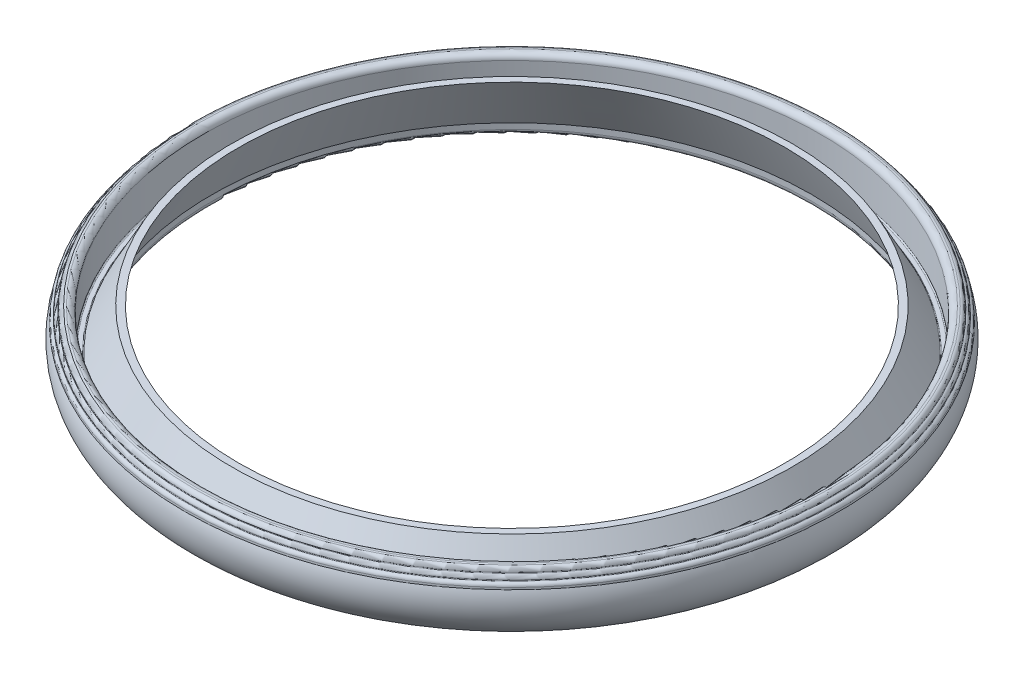
ISO-10303-21;
HEADER;
FILE_DESCRIPTION(('STEP AP214'),'2;1');
FILE_NAME('part.step','',(''),(''),'','','');
FILE_SCHEMA(('AUTOMOTIVE_DESIGN { 1 0 10303 214 1 1 1 1 }'));
ENDSEC;
DATA;
#1=APPLICATION_CONTEXT('core data for automotive mechanical design processes');
#2=APPLICATION_PROTOCOL_DEFINITION('international standard','automotive_design',2000,#1);
#3=PRODUCT_CONTEXT('',#1,'mechanical');
#4=PRODUCT('Part','Part','',(#3));
#5=PRODUCT_RELATED_PRODUCT_CATEGORY('part','',(#4));
#6=PRODUCT_DEFINITION_FORMATION('','',#4);
#7=PRODUCT_DEFINITION_CONTEXT('part definition',#1,'design');
#8=PRODUCT_DEFINITION('design','',#6,#7);
#9=PRODUCT_DEFINITION_SHAPE('','',#8);
#10=(LENGTH_UNIT() NAMED_UNIT(*) SI_UNIT(.MILLI.,.METRE.));
#11=(NAMED_UNIT(*) PLANE_ANGLE_UNIT() SI_UNIT($,.RADIAN.));
#12=(NAMED_UNIT(*) SI_UNIT($,.STERADIAN.) SOLID_ANGLE_UNIT());
#13=UNCERTAINTY_MEASURE_WITH_UNIT(LENGTH_MEASURE(1.E-05),#10,'distance_accuracy_value','');
#14=(GEOMETRIC_REPRESENTATION_CONTEXT(3) GLOBAL_UNCERTAINTY_ASSIGNED_CONTEXT((#13)) GLOBAL_UNIT_ASSIGNED_CONTEXT((#10,
#11,#12)) REPRESENTATION_CONTEXT('',''));
#15=CARTESIAN_POINT('',(0.,0.,0.));
#16=DIRECTION('',(0.,0.,1.));
#17=DIRECTION('',(1.,0.,0.));
#18=AXIS2_PLACEMENT_3D('',#15,#16,#17);
#19=CARTESIAN_POINT('',(0.,2.53999999999997,0.));
#20=DIRECTION('',(0.,-1.,0.));
#21=DIRECTION('',(0.,0.,-1.));
#22=AXIS2_PLACEMENT_3D('',#19,#20,#21);
#23=TOROIDAL_SURFACE('',#22,134.62,2.53999999999996);
#24=CARTESIAN_POINT('',(0.,0.,0.));
#25=DIRECTION('',(0.,-1.,0.));
#26=DIRECTION('',(0.,0.,-1.));
#27=AXIS2_PLACEMENT_3D('',#24,#25,#26);
#28=CIRCLE('',#27,134.62);
#29=CARTESIAN_POINT('',(0.,0.,-134.62));
#30=VERTEX_POINT('',#29);
#31=EDGE_CURVE('E101',#30,#30,#28,.T.);
#32=ORIENTED_EDGE('',*,*,#31,.T.);
#33=EDGE_LOOP('',(#32));
#34=FACE_BOUND('',#33,.T.);
#35=CARTESIAN_POINT('',(0.,2.53999999999998,0.));
#36=DIRECTION('',(0.,-1.,0.));
#37=DIRECTION('',(0.,0.,-1.));
#38=AXIS2_PLACEMENT_3D('',#35,#36,#37);
#39=CIRCLE('',#38,132.08);
#40=CARTESIAN_POINT('',(0.,2.53999999999998,-132.08));
#41=VERTEX_POINT('',#40);
#42=EDGE_CURVE('E89',#41,#41,#39,.T.);
#43=ORIENTED_EDGE('',*,*,#42,.F.);
#44=EDGE_LOOP('',(#43));
#45=FACE_BOUND('',#44,.T.);
#46=ADVANCED_FACE('F36',(#34,#45),#23,.T.);
#47=CARTESIAN_POINT('',(0.,0.,0.));
#48=DIRECTION('',(0.,-1.,0.));
#49=DIRECTION('',(0.,0.,-1.));
#50=AXIS2_PLACEMENT_3D('',#47,#48,#49);
#51=CYLINDRICAL_SURFACE('',#50,132.08);
#52=CARTESIAN_POINT('',(0.,5.07999999999995,0.));
#53=DIRECTION('',(0.,-1.,0.));
#54=DIRECTION('',(0.,0.,-1.));
#55=AXIS2_PLACEMENT_3D('',#52,#53,#54);
#56=CIRCLE('',#55,132.08);
#57=CARTESIAN_POINT('',(0.,5.07999999999995,-132.08));
#58=VERTEX_POINT('',#57);
#59=EDGE_CURVE('E93',#58,#58,#56,.T.);
#60=ORIENTED_EDGE('',*,*,#59,.F.);
#61=EDGE_LOOP('',(#60));
#62=FACE_BOUND('',#61,.T.);
#63=ORIENTED_EDGE('',*,*,#42,.T.);
#64=EDGE_LOOP('',(#63));
#65=FACE_BOUND('',#64,.T.);
#66=ADVANCED_FACE('F129',(#62,#65),#51,.F.);
#67=CARTESIAN_POINT('',(0.,5.07999999999995,0.));
#68=DIRECTION('',(0.,-1.,0.));
#69=DIRECTION('',(0.,0.,-1.));
#70=AXIS2_PLACEMENT_3D('',#67,#68,#69);
#71=CONICAL_SURFACE('',#70,132.08,0.455530934770517);
#72=CARTESIAN_POINT('',(0.,28.829,0.));
#73=DIRECTION('',(0.,-1.,0.));
#74=DIRECTION('',(0.,0.,-1.));
#75=AXIS2_PLACEMENT_3D('',#72,#73,#74);
#76=CIRCLE('',#75,120.445484950661);
#77=CARTESIAN_POINT('',(0.,28.829,-120.445484950661));
#78=VERTEX_POINT('',#77);
#79=EDGE_CURVE('E95',#78,#78,#76,.T.);
#80=ORIENTED_EDGE('',*,*,#79,.F.);
#81=EDGE_LOOP('',(#80));
#82=FACE_BOUND('',#81,.T.);
#83=ORIENTED_EDGE('',*,*,#59,.T.);
#84=EDGE_LOOP('',(#83));
#85=FACE_BOUND('',#84,.T.);
#86=ADVANCED_FACE('F133',(#82,#85),#71,.F.);
#87=CARTESIAN_POINT('',(1.31951923373762E-13,28.829,0.));
#88=DIRECTION('',(0.,-1.,0.));
#89=DIRECTION('',(0.,0.,-1.));
#90=AXIS2_PLACEMENT_3D('',#87,#88,#89);
#91=PLANE('',#90);
#92=CARTESIAN_POINT('',(0.,28.829,0.));
#93=DIRECTION('',(0.,-1.,0.));
#94=DIRECTION('',(0.,0.,-1.));
#95=AXIS2_PLACEMENT_3D('',#92,#93,#94);
#96=CIRCLE('',#95,123.477519152832);
#97=CARTESIAN_POINT('',(0.,28.829,-123.477519152832));
#98=VERTEX_POINT('',#97);
#99=EDGE_CURVE('E97',#98,#98,#96,.T.);
#100=ORIENTED_EDGE('',*,*,#99,.F.);
#101=EDGE_LOOP('',(#100));
#102=FACE_BOUND('',#101,.T.);
#103=ORIENTED_EDGE('',*,*,#79,.T.);
#104=EDGE_LOOP('',(#103));
#105=FACE_BOUND('',#104,.T.);
#106=ADVANCED_FACE('F284',(#102,#105),#91,.F.);
#107=CARTESIAN_POINT('',(0.,28.829,0.));
#108=DIRECTION('',(0.,-1.,0.));
#109=DIRECTION('',(0.,0.,-1.));
#110=AXIS2_PLACEMENT_3D('',#107,#108,#109);
#111=CONICAL_SURFACE('',#110,123.477519152832,0.497418836818253);
#112=CARTESIAN_POINT('',(0.,10.5272033497882,0.));
#113=DIRECTION('',(0.,1.,0.));
#114=DIRECTION('',(0.,0.,1.));
#115=AXIS2_PLACEMENT_3D('',#112,#113,#114);
#116=CIRCLE('',#115,133.414583957685);
#117=CARTESIAN_POINT('',(0.,10.5272033497882,133.414583957685));
#118=VERTEX_POINT('',#117);
#119=EDGE_CURVE('E79',#118,#118,#116,.T.);
#120=ORIENTED_EDGE('',*,*,#119,.T.);
#121=EDGE_LOOP('',(#120));
#122=FACE_BOUND('',#121,.T.);
#123=ORIENTED_EDGE('',*,*,#99,.T.);
#124=EDGE_LOOP('',(#123));
#125=FACE_BOUND('',#124,.T.);
#126=ADVANCED_FACE('F274',(#122,#125),#111,.T.);
#127=CARTESIAN_POINT('',(0.,10.2616,0.));
#128=DIRECTION('',(0.,1.,0.));
#129=DIRECTION('',(0.,0.,1.));
#130=AXIS2_PLACEMENT_3D('',#127,#128,#129);
#131=PLANE('',#130);
#132=CARTESIAN_POINT('',(0.,10.2616,0.));
#133=DIRECTION('',(0.,1.,0.));
#134=DIRECTION('',(0.,0.,1.));
#135=AXIS2_PLACEMENT_3D('',#132,#133,#134);
#136=CIRCLE('',#135,133.861023050917);
#137=CARTESIAN_POINT('',(0.,10.2616,133.861023050917));
#138=VERTEX_POINT('',#137);
#139=EDGE_CURVE('E85',#138,#138,#136,.F.);
#140=ORIENTED_EDGE('',*,*,#139,.T.);
#141=EDGE_LOOP('',(#140));
#142=FACE_BOUND('',#141,.T.);
#143=CARTESIAN_POINT('',(0.,10.2616,0.));
#144=DIRECTION('',(0.,1.,0.));
#145=DIRECTION('',(0.,0.,1.));
#146=AXIS2_PLACEMENT_3D('',#143,#144,#145);
#147=CIRCLE('',#146,135.587896276782);
#148=CARTESIAN_POINT('',(0.,10.2616,135.587896276782));
#149=VERTEX_POINT('',#148);
#150=EDGE_CURVE('E84',#149,#149,#147,.T.);
#151=ORIENTED_EDGE('',*,*,#150,.T.);
#152=EDGE_LOOP('',(#151));
#153=FACE_BOUND('',#152,.T.);
#154=ADVANCED_FACE('F263',(#142,#153),#131,.T.);
#155=CARTESIAN_POINT('',(0.,0.,0.));
#156=DIRECTION('',(0.,-1.,0.));
#157=DIRECTION('',(0.,0.,-1.));
#158=AXIS2_PLACEMENT_3D('',#155,#156,#157);
#159=CYLINDRICAL_SURFACE('',#158,136.095896276782);
#160=CARTESIAN_POINT('',(0.,26.0242975407193,0.));
#161=DIRECTION('',(0.,1.,0.));
#162=DIRECTION('',(0.,0.,1.));
#163=AXIS2_PLACEMENT_3D('',#160,#161,#162);
#164=CIRCLE('',#163,136.095896276782);
#165=CARTESIAN_POINT('',(0.,26.0242975407193,136.095896276782));
#166=VERTEX_POINT('',#165);
#167=EDGE_CURVE('E68',#166,#166,#164,.T.);
#168=ORIENTED_EDGE('',*,*,#167,.T.);
#169=EDGE_LOOP('',(#168));
#170=FACE_BOUND('',#169,.T.);
#171=CARTESIAN_POINT('',(0.,10.7696,0.));
#172=DIRECTION('',(0.,1.,0.));
#173=DIRECTION('',(0.,0.,1.));
#174=AXIS2_PLACEMENT_3D('',#171,#172,#173);
#175=CIRCLE('',#174,136.095896276782);
#176=CARTESIAN_POINT('',(0.,10.7696,136.095896276782));
#177=VERTEX_POINT('',#176);
#178=EDGE_CURVE('E77',#177,#177,#175,.F.);
#179=ORIENTED_EDGE('',*,*,#178,.T.);
#180=EDGE_LOOP('',(#179));
#181=FACE_BOUND('',#180,.T.);
#182=ADVANCED_FACE('F256',(#170,#181),#159,.F.);
#183=CARTESIAN_POINT('',(0.,28.7962211334353,0.));
#184=DIRECTION('',(0.,-1.,0.));
#185=DIRECTION('',(0.,0.,-1.));
#186=AXIS2_PLACEMENT_3D('',#183,#184,#185);
#187=CONICAL_SURFACE('',#186,136.095896276782,1.48352986419517);
#188=CARTESIAN_POINT('',(0.,28.4793221398566,0.));
#189=DIRECTION('',(0.,1.,0.));
#190=DIRECTION('',(0.,0.,1.));
#191=AXIS2_PLACEMENT_3D('',#188,#189,#190);
#192=CIRCLE('',#191,139.718068348079);
#193=CARTESIAN_POINT('',(0.,28.4793221398566,139.718068348079));
#194=VERTEX_POINT('',#193);
#195=EDGE_CURVE('E59',#194,#194,#192,.T.);
#196=ORIENTED_EDGE('',*,*,#195,.T.);
#197=EDGE_LOOP('',(#196));
#198=FACE_BOUND('',#197,.T.);
#199=CARTESIAN_POINT('',(0.,28.5546320738723,0.));
#200=DIRECTION('',(0.,-1.,0.));
#201=DIRECTION('',(0.,0.,-1.));
#202=AXIS2_PLACEMENT_3D('',#199,#200,#201);
#203=CIRCLE('',#202,138.857271863361);
#204=CARTESIAN_POINT('',(0.,28.5546320738723,-138.857271863361));
#205=VERTEX_POINT('',#204);
#206=EDGE_CURVE('E74',#205,#205,#203,.T.);
#207=ORIENTED_EDGE('',*,*,#206,.T.);
#208=EDGE_LOOP('',(#207));
#209=FACE_BOUND('',#208,.T.);
#210=ADVANCED_FACE('F247',(#198,#209),#187,.T.);
#211=CARTESIAN_POINT('',(0.,28.344614936814,0.));
#212=DIRECTION('',(0.,-1.,0.));
#213=DIRECTION('',(0.,0.,-1.));
#214=AXIS2_PLACEMENT_3D('',#211,#212,#213);
#215=CONICAL_SURFACE('',#214,141.257778724414,0.052359877559825);
#216=CARTESIAN_POINT('',(0.,26.7834662209108,0.));
#217=DIRECTION('',(0.,1.,0.));
#218=DIRECTION('',(0.,0.,1.));
#219=AXIS2_PLACEMENT_3D('',#216,#217,#218);
#220=CIRCLE('',#219,141.339595061746);
#221=CARTESIAN_POINT('',(0.,26.7834662209108,141.339595061746));
#222=VERTEX_POINT('',#221);
#223=EDGE_CURVE('E10',#222,#222,#220,.T.);
#224=ORIENTED_EDGE('',*,*,#223,.T.);
#225=EDGE_LOOP('',(#224));
#226=FACE_BOUND('',#225,.T.);
#227=CARTESIAN_POINT('',(0.,26.8011412968492,0.));
#228=DIRECTION('',(0.,1.,0.));
#229=DIRECTION('',(0.,0.,1.));
#230=AXIS2_PLACEMENT_3D('',#227,#228,#229);
#231=CIRCLE('',#230,141.338668750267);
#232=CARTESIAN_POINT('',(0.,26.8011412968492,141.338668750267));
#233=VERTEX_POINT('',#232);
#234=EDGE_CURVE('E61',#233,#233,#231,.F.);
#235=ORIENTED_EDGE('',*,*,#234,.T.);
#236=EDGE_LOOP('',(#235));
#237=FACE_BOUND('',#236,.T.);
#238=ADVANCED_FACE('F126',(#226,#237),#215,.T.);
#239=CARTESIAN_POINT('',(0.,26.4748739974505,0.));
#240=DIRECTION('',(0.,-1.,0.));
#241=DIRECTION('',(0.,0.,-1.));
#242=AXIS2_PLACEMENT_3D('',#239,#240,#241);
#243=CONICAL_SURFACE('',#242,142.715883369229,0.0523598775598341);
#244=CARTESIAN_POINT('',(0.,24.8241939038469,0.));
#245=DIRECTION('',(0.,1.,0.));
#246=DIRECTION('',(0.,0.,1.));
#247=AXIS2_PLACEMENT_3D('',#244,#245,#246);
#248=CIRCLE('',#247,142.802391847241);
#249=CARTESIAN_POINT('',(0.,24.8241939038469,142.802391847241));
#250=VERTEX_POINT('',#249);
#251=EDGE_CURVE('E47',#250,#250,#248,.T.);
#252=ORIENTED_EDGE('',*,*,#251,.T.);
#253=EDGE_LOOP('',(#252));
#254=FACE_BOUND('',#253,.T.);
#255=CARTESIAN_POINT('',(0.,24.9401271782035,0.));
#256=DIRECTION('',(0.,1.,0.));
#257=DIRECTION('',(0.,0.,1.));
#258=AXIS2_PLACEMENT_3D('',#255,#256,#257);
#259=CIRCLE('',#258,142.796316041787);
#260=CARTESIAN_POINT('',(0.,24.9401271782035,142.796316041787));
#261=VERTEX_POINT('',#260);
#262=EDGE_CURVE('E63',#261,#261,#259,.F.);
#263=ORIENTED_EDGE('',*,*,#262,.T.);
#264=EDGE_LOOP('',(#263));
#265=FACE_BOUND('',#264,.T.);
#266=ADVANCED_FACE('F117',(#254,#265),#243,.T.);
#267=CARTESIAN_POINT('',(0.,24.5401062668675,0.));
#268=DIRECTION('',(0.,-1.,0.));
#269=DIRECTION('',(0.,0.,-1.));
#270=AXIS2_PLACEMENT_3D('',#267,#268,#269);
#271=CONICAL_SURFACE('',#270,144.051459287251,0.0523598775598296);
#272=CARTESIAN_POINT('',(0.,23.0231557855234,0.));
#273=DIRECTION('',(0.,1.,0.));
#274=DIRECTION('',(0.,0.,1.));
#275=AXIS2_PLACEMENT_3D('',#272,#273,#274);
#276=CIRCLE('',#275,144.13095929326);
#277=CARTESIAN_POINT('',(0.,23.0231557855234,144.13095929326));
#278=VERTEX_POINT('',#277);
#279=EDGE_CURVE('E70',#278,#278,#276,.F.);
#280=ORIENTED_EDGE('',*,*,#279,.T.);
#281=EDGE_LOOP('',(#280));
#282=FACE_BOUND('',#281,.T.);
#283=CARTESIAN_POINT('',(0.,22.1557783896875,0.));
#284=DIRECTION('',(0.,-1.,0.));
#285=DIRECTION('',(0.,0.,-1.));
#286=AXIS2_PLACEMENT_3D('',#283,#284,#285);
#287=CIRCLE('',#286,144.176416616376);
#288=CARTESIAN_POINT('',(0.,22.1557783896875,-144.176416616376));
#289=VERTEX_POINT('',#288);
#290=EDGE_CURVE('E99',#289,#289,#287,.T.);
#291=ORIENTED_EDGE('',*,*,#290,.F.);
#292=EDGE_LOOP('',(#291));
#293=FACE_BOUND('',#292,.T.);
#294=ADVANCED_FACE('F113',(#282,#293),#271,.T.);
#295=CARTESIAN_POINT('',(0.,16.0850218899426,0.));
#296=DIRECTION('',(0.,-1.,0.));
#297=DIRECTION('',(0.,0.,-1.));
#298=AXIS2_PLACEMENT_3D('',#295,#296,#297);
#299=TOROIDAL_SURFACE('',#298,127.789576452366,17.4752);
#300=ORIENTED_EDGE('',*,*,#31,.F.);
#301=EDGE_LOOP('',(#300));
#302=FACE_BOUND('',#301,.T.);
#303=ORIENTED_EDGE('',*,*,#290,.T.);
#304=EDGE_LOOP('',(#303));
#305=FACE_BOUND('',#304,.T.);
#306=ADVANCED_FACE('F107',(#302,#305),#299,.T.);
#307=CARTESIAN_POINT('',(0.,10.7696,0.));
#308=DIRECTION('',(0.,1.,0.));
#309=DIRECTION('',(0.,0.,1.));
#310=AXIS2_PLACEMENT_3D('',#307,#308,#309);
#311=TOROIDAL_SURFACE('',#310,133.861023050917,0.508);
#312=ORIENTED_EDGE('',*,*,#119,.F.);
#313=EDGE_LOOP('',(#312));
#314=FACE_BOUND('',#313,.T.);
#315=ORIENTED_EDGE('',*,*,#139,.F.);
#316=EDGE_LOOP('',(#315));
#317=FACE_BOUND('',#316,.T.);
#318=ADVANCED_FACE('F115',(#314,#317),#311,.F.);
#319=CARTESIAN_POINT('',(0.,10.7696,0.));
#320=DIRECTION('',(0.,1.,0.));
#321=DIRECTION('',(0.,0.,1.));
#322=AXIS2_PLACEMENT_3D('',#319,#320,#321);
#323=TOROIDAL_SURFACE('',#322,135.587896276782,0.508);
#324=ORIENTED_EDGE('',*,*,#150,.F.);
#325=EDGE_LOOP('',(#324));
#326=FACE_BOUND('',#325,.T.);
#327=ORIENTED_EDGE('',*,*,#178,.F.);
#328=EDGE_LOOP('',(#327));
#329=FACE_BOUND('',#328,.T.);
#330=ADVANCED_FACE('F145',(#326,#329),#323,.F.);
#331=CARTESIAN_POINT('',(0.,26.0242975407193,0.));
#332=DIRECTION('',(0.,1.,0.));
#333=DIRECTION('',(0.,0.,1.));
#334=AXIS2_PLACEMENT_3D('',#331,#332,#333);
#335=TOROIDAL_SURFACE('',#334,138.635896276782,2.54);
#336=ORIENTED_EDGE('',*,*,#167,.F.);
#337=EDGE_LOOP('',(#336));
#338=FACE_BOUND('',#337,.T.);
#339=ORIENTED_EDGE('',*,*,#206,.F.);
#340=EDGE_LOOP('',(#339));
#341=FACE_BOUND('',#340,.T.);
#342=ADVANCED_FACE('F146',(#338,#341),#335,.T.);
#343=CARTESIAN_POINT('',(0.,22.9301024553235,0.));
#344=DIRECTION('',(0.,1.,0.));
#345=DIRECTION('',(0.,0.,1.));
#346=AXIS2_PLACEMENT_3D('',#343,#344,#345);
#347=TOROIDAL_SURFACE('',#346,142.355395980467,1.778);
#348=CARTESIAN_POINT('',(0.,24.5990641390511,0.));
#349=DIRECTION('',(0.,-1.,0.));
#350=DIRECTION('',(0.,0.,-1.));
#351=AXIS2_PLACEMENT_3D('',#348,#349,#350);
#352=CIRCLE('',#351,142.968462777991);
#353=CARTESIAN_POINT('',(0.,24.5990641390511,-142.968462777991));
#354=VERTEX_POINT('',#353);
#355=EDGE_CURVE('E52',#354,#354,#352,.T.);
#356=ORIENTED_EDGE('',*,*,#355,.T.);
#357=EDGE_LOOP('',(#356));
#358=FACE_BOUND('',#357,.T.);
#359=ORIENTED_EDGE('',*,*,#279,.F.);
#360=EDGE_LOOP('',(#359));
#361=FACE_BOUND('',#360,.T.);
#362=ADVANCED_FACE('F149',(#358,#361),#347,.T.);
#363=CARTESIAN_POINT('',(0.,24.8470738480039,0.));
#364=DIRECTION('',(0.,1.,0.));
#365=DIRECTION('',(0.,0.,1.));
#366=AXIS2_PLACEMENT_3D('',#363,#364,#365);
#367=TOROIDAL_SURFACE('',#366,141.020752728993,1.778);
#368=CARTESIAN_POINT('',(0.,26.553048840549,0.));
#369=DIRECTION('',(0.,-1.,0.));
#370=DIRECTION('',(0.,0.,-1.));
#371=AXIS2_PLACEMENT_3D('',#368,#369,#370);
#372=CIRCLE('',#371,141.521685184244);
#373=CARTESIAN_POINT('',(0.,26.553048840549,-141.521685184244));
#374=VERTEX_POINT('',#373);
#375=EDGE_CURVE('E44',#374,#374,#372,.T.);
#376=ORIENTED_EDGE('',*,*,#375,.T.);
#377=EDGE_LOOP('',(#376));
#378=FACE_BOUND('',#377,.T.);
#379=ORIENTED_EDGE('',*,*,#262,.F.);
#380=EDGE_LOOP('',(#379));
#381=FACE_BOUND('',#380,.T.);
#382=ADVANCED_FACE('F151',(#378,#381),#367,.T.);
#383=CARTESIAN_POINT('',(0.,26.7080879666495,0.));
#384=DIRECTION('',(0.,1.,0.));
#385=DIRECTION('',(0.,0.,1.));
#386=AXIS2_PLACEMENT_3D('',#383,#384,#385);
#387=TOROIDAL_SURFACE('',#386,139.563105437473,1.778);
#388=ORIENTED_EDGE('',*,*,#195,.F.);
#389=EDGE_LOOP('',(#388));
#390=FACE_BOUND('',#389,.T.);
#391=ORIENTED_EDGE('',*,*,#234,.F.);
#392=EDGE_LOOP('',(#391));
#393=FACE_BOUND('',#392,.T.);
#394=ADVANCED_FACE('F157',(#390,#393),#387,.T.);
#395=CARTESIAN_POINT('',(0.,24.8374872367331,0.));
#396=DIRECTION('',(0.,-1.,0.));
#397=DIRECTION('',(0.,0.,-1.));
#398=AXIS2_PLACEMENT_3D('',#395,#396,#397);
#399=TOROIDAL_SURFACE('',#398,143.056043749069,0.254);
#400=ORIENTED_EDGE('',*,*,#251,.F.);
#401=EDGE_LOOP('',(#400));
#402=FACE_BOUND('',#401,.T.);
#403=ORIENTED_EDGE('',*,*,#355,.F.);
#404=EDGE_LOOP('',(#403));
#405=FACE_BOUND('',#404,.T.);
#406=ADVANCED_FACE('F160',(#402,#405),#399,.F.);
#407=CARTESIAN_POINT('',(0.,26.7967595537967,0.));
#408=DIRECTION('',(0.,-1.,0.));
#409=DIRECTION('',(0.,0.,-1.));
#410=AXIS2_PLACEMENT_3D('',#407,#408,#409);
#411=TOROIDAL_SURFACE('',#410,141.593246963573,0.254);
#412=ORIENTED_EDGE('',*,*,#223,.F.);
#413=EDGE_LOOP('',(#412));
#414=FACE_BOUND('',#413,.T.);
#415=ORIENTED_EDGE('',*,*,#375,.F.);
#416=EDGE_LOOP('',(#415));
#417=FACE_BOUND('',#416,.T.);
#418=ADVANCED_FACE('F37',(#414,#417),#411,.F.);
#419=CLOSED_SHELL('',(#46,#66,#86,#106,#126,#154,#182,#210,#238,#266,#294,#306,#318,#330,#342,
#362,#382,#394,#406,#418));
#420=MANIFOLD_SOLID_BREP('B2',#419);
#421=ADVANCED_BREP_SHAPE_REPRESENTATION('',(#18,#420),#14);
#422=SHAPE_DEFINITION_REPRESENTATION(#9,#421);
ENDSEC;
END-ISO-10303-21;
